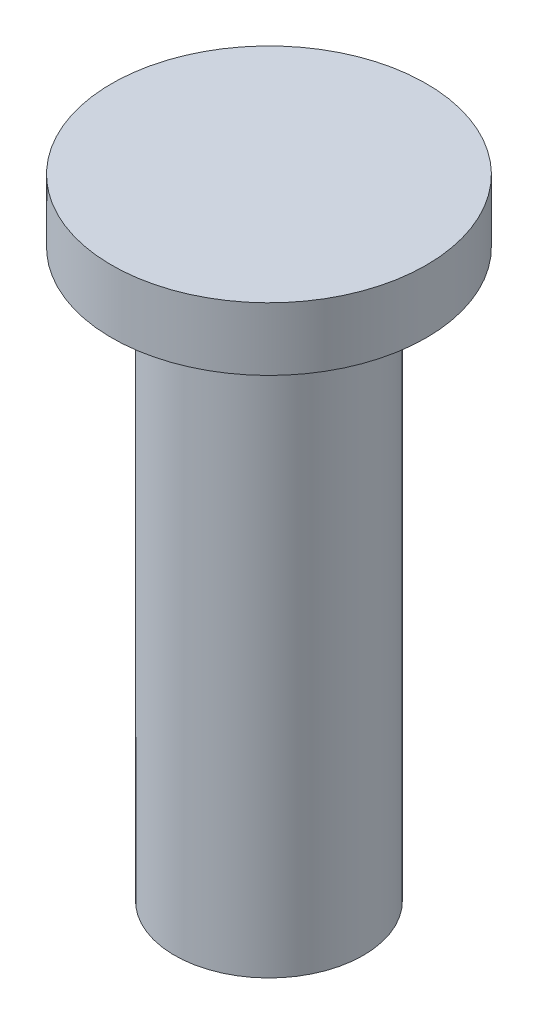
ISO-10303-21;
HEADER;
FILE_DESCRIPTION(('STEP AP214'),'2;1');
FILE_NAME('part.step','',(''),(''),'','','');
FILE_SCHEMA(('AUTOMOTIVE_DESIGN { 1 0 10303 214 1 1 1 1 }'));
ENDSEC;
DATA;
#1=APPLICATION_CONTEXT('core data for automotive mechanical design processes');
#2=APPLICATION_PROTOCOL_DEFINITION('international standard','automotive_design',2000,#1);
#3=PRODUCT_CONTEXT('',#1,'mechanical');
#4=PRODUCT('Part','Part','',(#3));
#5=PRODUCT_RELATED_PRODUCT_CATEGORY('part','',(#4));
#6=PRODUCT_DEFINITION_FORMATION('','',#4);
#7=PRODUCT_DEFINITION_CONTEXT('part definition',#1,'design');
#8=PRODUCT_DEFINITION('design','',#6,#7);
#9=PRODUCT_DEFINITION_SHAPE('','',#8);
#10=(LENGTH_UNIT() NAMED_UNIT(*) SI_UNIT(.MILLI.,.METRE.));
#11=(NAMED_UNIT(*) PLANE_ANGLE_UNIT() SI_UNIT($,.RADIAN.));
#12=(NAMED_UNIT(*) SI_UNIT($,.STERADIAN.) SOLID_ANGLE_UNIT());
#13=UNCERTAINTY_MEASURE_WITH_UNIT(LENGTH_MEASURE(1.E-05),#10,'distance_accuracy_value','');
#14=(GEOMETRIC_REPRESENTATION_CONTEXT(3) GLOBAL_UNCERTAINTY_ASSIGNED_CONTEXT((#13)) GLOBAL_UNIT_ASSIGNED_CONTEXT((#10,
#11,#12)) REPRESENTATION_CONTEXT('',''));
#15=CARTESIAN_POINT('',(0.,0.,0.));
#16=DIRECTION('',(0.,0.,1.));
#17=DIRECTION('',(1.,0.,0.));
#18=AXIS2_PLACEMENT_3D('',#15,#16,#17);
#19=CARTESIAN_POINT('',(-1.5,-1.26923076923077,0.));
#20=DIRECTION('',(0.,1.,0.));
#21=DIRECTION('',(-1.,0.,0.));
#22=AXIS2_PLACEMENT_3D('',#19,#20,#21);
#23=PLANE('',#22);
#24=CARTESIAN_POINT('',(0.,-1.26923076923077,0.));
#25=DIRECTION('',(0.,-1.,0.));
#26=DIRECTION('',(1.,0.,0.));
#27=AXIS2_PLACEMENT_3D('',#24,#25,#26);
#28=CIRCLE('',#27,1.5);
#29=CARTESIAN_POINT('',(1.5,-1.26923076923077,0.));
#30=VERTEX_POINT('',#29);
#31=EDGE_CURVE('E51',#30,#30,#28,.T.);
#32=ORIENTED_EDGE('',*,*,#31,.T.);
#33=EDGE_LOOP('',(#32));
#34=FACE_BOUND('',#33,.T.);
#35=ADVANCED_FACE('F37',(#34),#23,.F.);
#36=CARTESIAN_POINT('',(0.,8.73076923076923,0.));
#37=DIRECTION('',(0.,-1.,0.));
#38=DIRECTION('',(1.,0.,0.));
#39=AXIS2_PLACEMENT_3D('',#36,#37,#38);
#40=PLANE('',#39);
#41=CARTESIAN_POINT('',(0.,8.73076923076923,0.));
#42=DIRECTION('',(0.,-1.,0.));
#43=DIRECTION('',(1.,0.,0.));
#44=AXIS2_PLACEMENT_3D('',#41,#42,#43);
#45=CIRCLE('',#44,2.5);
#46=CARTESIAN_POINT('',(2.5,8.73076923076923,0.));
#47=VERTEX_POINT('',#46);
#48=EDGE_CURVE('E10',#47,#47,#45,.T.);
#49=ORIENTED_EDGE('',*,*,#48,.F.);
#50=EDGE_LOOP('',(#49));
#51=FACE_BOUND('',#50,.T.);
#52=ADVANCED_FACE('F71',(#51),#40,.F.);
#53=CARTESIAN_POINT('',(0.,-1.26923076923077,0.));
#54=DIRECTION('',(0.,-1.,0.));
#55=DIRECTION('',(1.,0.,0.));
#56=AXIS2_PLACEMENT_3D('',#53,#54,#55);
#57=CYLINDRICAL_SURFACE('',#56,2.5);
#58=CARTESIAN_POINT('',(0.,7.73076923076923,0.));
#59=DIRECTION('',(0.,-1.,0.));
#60=DIRECTION('',(1.,0.,0.));
#61=AXIS2_PLACEMENT_3D('',#58,#59,#60);
#62=CIRCLE('',#61,2.5);
#63=CARTESIAN_POINT('',(2.5,7.73076923076923,0.));
#64=VERTEX_POINT('',#63);
#65=EDGE_CURVE('E43',#64,#64,#62,.T.);
#66=ORIENTED_EDGE('',*,*,#65,.F.);
#67=EDGE_LOOP('',(#66));
#68=FACE_BOUND('',#67,.T.);
#69=ORIENTED_EDGE('',*,*,#48,.T.);
#70=EDGE_LOOP('',(#69));
#71=FACE_BOUND('',#70,.T.);
#72=ADVANCED_FACE('F66',(#68,#71),#57,.T.);
#73=CARTESIAN_POINT('',(-2.5,7.73076923076923,0.));
#74=DIRECTION('',(0.,1.,0.));
#75=DIRECTION('',(-1.,0.,0.));
#76=AXIS2_PLACEMENT_3D('',#73,#74,#75);
#77=PLANE('',#76);
#78=CARTESIAN_POINT('',(0.,7.73076923076923,0.));
#79=DIRECTION('',(0.,-1.,0.));
#80=DIRECTION('',(1.,0.,0.));
#81=AXIS2_PLACEMENT_3D('',#78,#79,#80);
#82=CIRCLE('',#81,1.5);
#83=CARTESIAN_POINT('',(1.5,7.73076923076923,0.));
#84=VERTEX_POINT('',#83);
#85=EDGE_CURVE('E47',#84,#84,#82,.T.);
#86=ORIENTED_EDGE('',*,*,#85,.F.);
#87=EDGE_LOOP('',(#86));
#88=FACE_BOUND('',#87,.T.);
#89=ORIENTED_EDGE('',*,*,#65,.T.);
#90=EDGE_LOOP('',(#89));
#91=FACE_BOUND('',#90,.T.);
#92=ADVANCED_FACE('F61',(#88,#91),#77,.F.);
#93=CARTESIAN_POINT('',(0.,-1.26923076923077,0.));
#94=DIRECTION('',(0.,-1.,0.));
#95=DIRECTION('',(1.,0.,0.));
#96=AXIS2_PLACEMENT_3D('',#93,#94,#95);
#97=CYLINDRICAL_SURFACE('',#96,1.5);
#98=ORIENTED_EDGE('',*,*,#31,.F.);
#99=EDGE_LOOP('',(#98));
#100=FACE_BOUND('',#99,.T.);
#101=ORIENTED_EDGE('',*,*,#85,.T.);
#102=EDGE_LOOP('',(#101));
#103=FACE_BOUND('',#102,.T.);
#104=ADVANCED_FACE('F58',(#100,#103),#97,.T.);
#105=CLOSED_SHELL('',(#35,#52,#72,#92,#104));
#106=MANIFOLD_SOLID_BREP('B2',#105);
#107=ADVANCED_BREP_SHAPE_REPRESENTATION('',(#18,#106),#14);
#108=SHAPE_DEFINITION_REPRESENTATION(#9,#107);
ENDSEC;
END-ISO-10303-21;
